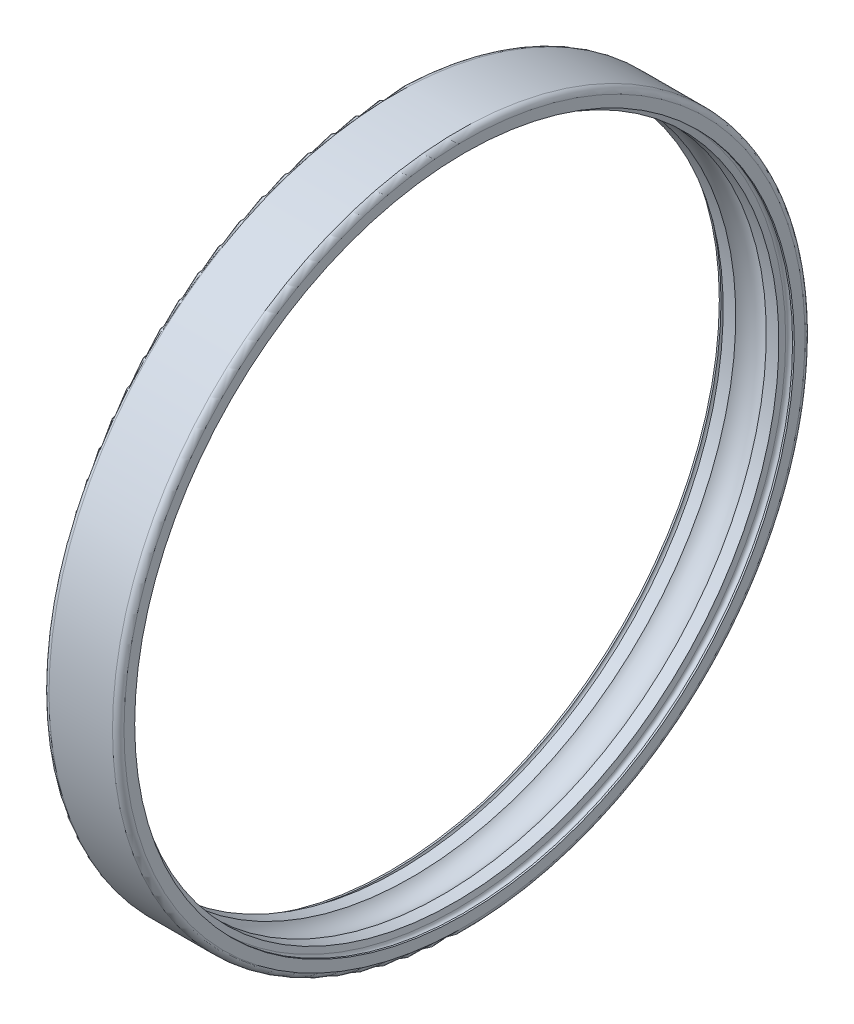
ISO-10303-21;
HEADER;
FILE_DESCRIPTION(('STEP AP214'),'2;1');
FILE_NAME('part.step','',(''),(''),'','','');
FILE_SCHEMA(('AUTOMOTIVE_DESIGN { 1 0 10303 214 1 1 1 1 }'));
ENDSEC;
DATA;
#1=APPLICATION_CONTEXT('core data for automotive mechanical design processes');
#2=APPLICATION_PROTOCOL_DEFINITION('international standard','automotive_design',2000,#1);
#3=PRODUCT_CONTEXT('',#1,'mechanical');
#4=PRODUCT('Part','Part','',(#3));
#5=PRODUCT_RELATED_PRODUCT_CATEGORY('part','',(#4));
#6=PRODUCT_DEFINITION_FORMATION('','',#4);
#7=PRODUCT_DEFINITION_CONTEXT('part definition',#1,'design');
#8=PRODUCT_DEFINITION('design','',#6,#7);
#9=PRODUCT_DEFINITION_SHAPE('','',#8);
#10=(LENGTH_UNIT() NAMED_UNIT(*) SI_UNIT(.MILLI.,.METRE.));
#11=(NAMED_UNIT(*) PLANE_ANGLE_UNIT() SI_UNIT($,.RADIAN.));
#12=(NAMED_UNIT(*) SI_UNIT($,.STERADIAN.) SOLID_ANGLE_UNIT());
#13=UNCERTAINTY_MEASURE_WITH_UNIT(LENGTH_MEASURE(1.E-05),#10,'distance_accuracy_value','');
#14=(GEOMETRIC_REPRESENTATION_CONTEXT(3) GLOBAL_UNCERTAINTY_ASSIGNED_CONTEXT((#13)) GLOBAL_UNIT_ASSIGNED_CONTEXT((#10,
#11,#12)) REPRESENTATION_CONTEXT('',''));
#15=CARTESIAN_POINT('',(0.,0.,0.));
#16=DIRECTION('',(0.,0.,1.));
#17=DIRECTION('',(1.,0.,0.));
#18=AXIS2_PLACEMENT_3D('',#15,#16,#17);
#19=CARTESIAN_POINT('',(0.,59.,0.));
#20=DIRECTION('',(1.,0.,0.));
#21=DIRECTION('',(0.,0.,-1.));
#22=AXIS2_PLACEMENT_3D('',#19,#20,#21);
#23=PLANE('',#22);
#24=CARTESIAN_POINT('',(0.,0.,0.));
#25=DIRECTION('',(-1.,0.,0.));
#26=DIRECTION('',(0.,0.,1.));
#27=AXIS2_PLACEMENT_3D('',#24,#25,#26);
#28=CIRCLE('',#27,57.15);
#29=CARTESIAN_POINT('',(0.,0.,57.15));
#30=VERTEX_POINT('',#29);
#31=EDGE_CURVE('E77',#30,#30,#28,.T.);
#32=ORIENTED_EDGE('',*,*,#31,.F.);
#33=EDGE_LOOP('',(#32));
#34=FACE_BOUND('',#33,.T.);
#35=CARTESIAN_POINT('',(0.,0.,0.));
#36=DIRECTION('',(-1.,0.,0.));
#37=DIRECTION('',(0.,0.,1.));
#38=AXIS2_PLACEMENT_3D('',#35,#36,#37);
#39=CIRCLE('',#38,59.);
#40=CARTESIAN_POINT('',(0.,0.,59.));
#41=VERTEX_POINT('',#40);
#42=EDGE_CURVE('E10',#41,#41,#39,.T.);
#43=ORIENTED_EDGE('',*,*,#42,.T.);
#44=EDGE_LOOP('',(#43));
#45=FACE_BOUND('',#44,.T.);
#46=ADVANCED_FACE('F31',(#34,#45),#23,.F.);
#47=CARTESIAN_POINT('',(0.99999999999922,0.,0.));
#48=DIRECTION('',(-1.,0.,0.));
#49=DIRECTION('',(0.,0.,1.));
#50=AXIS2_PLACEMENT_3D('',#47,#48,#49);
#51=TOROIDAL_SURFACE('',#50,59.0000000000008,0.999999999999222);
#52=ORIENTED_EDGE('',*,*,#42,.F.);
#53=EDGE_LOOP('',(#52));
#54=FACE_BOUND('',#53,.T.);
#55=CARTESIAN_POINT('',(1.,0.,0.));
#56=DIRECTION('',(-1.,0.,0.));
#57=DIRECTION('',(0.,0.,1.));
#58=AXIS2_PLACEMENT_3D('',#55,#56,#57);
#59=CIRCLE('',#58,60.);
#60=CARTESIAN_POINT('',(1.,0.,60.));
#61=VERTEX_POINT('',#60);
#62=EDGE_CURVE('E37',#61,#61,#59,.T.);
#63=ORIENTED_EDGE('',*,*,#62,.T.);
#64=EDGE_LOOP('',(#63));
#65=FACE_BOUND('',#64,.T.);
#66=ADVANCED_FACE('F84',(#54,#65),#51,.T.);
#67=CARTESIAN_POINT('',(50.,0.,0.));
#68=DIRECTION('',(-1.,0.,0.));
#69=DIRECTION('',(0.,0.,1.));
#70=AXIS2_PLACEMENT_3D('',#67,#68,#69);
#71=CYLINDRICAL_SURFACE('',#70,60.);
#72=ORIENTED_EDGE('',*,*,#62,.F.);
#73=EDGE_LOOP('',(#72));
#74=FACE_BOUND('',#73,.T.);
#75=CARTESIAN_POINT('',(12.,0.,0.));
#76=DIRECTION('',(-1.,0.,0.));
#77=DIRECTION('',(0.,0.,1.));
#78=AXIS2_PLACEMENT_3D('',#75,#76,#77);
#79=CIRCLE('',#78,60.);
#80=CARTESIAN_POINT('',(12.,0.,60.));
#81=VERTEX_POINT('',#80);
#82=EDGE_CURVE('E41',#81,#81,#79,.T.);
#83=ORIENTED_EDGE('',*,*,#82,.T.);
#84=EDGE_LOOP('',(#83));
#85=FACE_BOUND('',#84,.T.);
#86=ADVANCED_FACE('F88',(#74,#85),#71,.T.);
#87=CARTESIAN_POINT('',(12.0000000000015,0.,0.));
#88=DIRECTION('',(-1.,0.,0.));
#89=DIRECTION('',(0.,0.,1.));
#90=AXIS2_PLACEMENT_3D('',#87,#88,#89);
#91=TOROIDAL_SURFACE('',#90,59.0000000000015,0.999999999998453);
#92=ORIENTED_EDGE('',*,*,#82,.F.);
#93=EDGE_LOOP('',(#92));
#94=FACE_BOUND('',#93,.T.);
#95=CARTESIAN_POINT('',(13.,0.,0.));
#96=DIRECTION('',(-1.,0.,0.));
#97=DIRECTION('',(0.,0.,1.));
#98=AXIS2_PLACEMENT_3D('',#95,#96,#97);
#99=CIRCLE('',#98,59.);
#100=CARTESIAN_POINT('',(13.,0.,59.));
#101=VERTEX_POINT('',#100);
#102=EDGE_CURVE('E45',#101,#101,#99,.T.);
#103=ORIENTED_EDGE('',*,*,#102,.T.);
#104=EDGE_LOOP('',(#103));
#105=FACE_BOUND('',#104,.T.);
#106=ADVANCED_FACE('F93',(#94,#105),#91,.T.);
#107=CARTESIAN_POINT('',(13.,57.15,0.));
#108=DIRECTION('',(-1.,0.,0.));
#109=DIRECTION('',(0.,0.,1.));
#110=AXIS2_PLACEMENT_3D('',#107,#108,#109);
#111=PLANE('',#110);
#112=ORIENTED_EDGE('',*,*,#102,.F.);
#113=EDGE_LOOP('',(#112));
#114=FACE_BOUND('',#113,.T.);
#115=CARTESIAN_POINT('',(13.,0.,0.));
#116=DIRECTION('',(-1.,0.,0.));
#117=DIRECTION('',(0.,0.,1.));
#118=AXIS2_PLACEMENT_3D('',#115,#116,#117);
#119=CIRCLE('',#118,57.15);
#120=CARTESIAN_POINT('',(13.,0.,57.15));
#121=VERTEX_POINT('',#120);
#122=EDGE_CURVE('E50',#121,#121,#119,.T.);
#123=ORIENTED_EDGE('',*,*,#122,.T.);
#124=EDGE_LOOP('',(#123));
#125=FACE_BOUND('',#124,.T.);
#126=ADVANCED_FACE('F99',(#114,#125),#111,.F.);
#127=CARTESIAN_POINT('',(50.,0.,0.));
#128=DIRECTION('',(-1.,0.,0.));
#129=DIRECTION('',(0.,0.,1.));
#130=AXIS2_PLACEMENT_3D('',#127,#128,#129);
#131=CYLINDRICAL_SURFACE('',#130,57.15);
#132=ORIENTED_EDGE('',*,*,#122,.F.);
#133=EDGE_LOOP('',(#132));
#134=FACE_BOUND('',#133,.T.);
#135=CARTESIAN_POINT('',(12.7,0.,0.));
#136=DIRECTION('',(-1.,0.,0.));
#137=DIRECTION('',(0.,0.,1.));
#138=AXIS2_PLACEMENT_3D('',#135,#136,#137);
#139=CIRCLE('',#138,57.15);
#140=CARTESIAN_POINT('',(12.7,0.,57.15));
#141=VERTEX_POINT('',#140);
#142=EDGE_CURVE('E53',#141,#141,#139,.T.);
#143=ORIENTED_EDGE('',*,*,#142,.T.);
#144=EDGE_LOOP('',(#143));
#145=FACE_BOUND('',#144,.T.);
#146=ADVANCED_FACE('F103',(#134,#145),#131,.F.);
#147=CARTESIAN_POINT('',(12.1,0.,0.));
#148=DIRECTION('',(-1.,0.,0.));
#149=DIRECTION('',(0.,0.,1.));
#150=AXIS2_PLACEMENT_3D('',#147,#148,#149);
#151=TOROIDAL_SURFACE('',#150,57.15,0.6);
#152=ORIENTED_EDGE('',*,*,#142,.F.);
#153=EDGE_LOOP('',(#152));
#154=FACE_BOUND('',#153,.T.);
#155=CARTESIAN_POINT('',(11.5,0.,0.));
#156=DIRECTION('',(-1.,0.,0.));
#157=DIRECTION('',(0.,0.,1.));
#158=AXIS2_PLACEMENT_3D('',#155,#156,#157);
#159=CIRCLE('',#158,57.15);
#160=CARTESIAN_POINT('',(11.5,0.,57.15));
#161=VERTEX_POINT('',#160);
#162=EDGE_CURVE('E56',#161,#161,#159,.T.);
#163=ORIENTED_EDGE('',*,*,#162,.T.);
#164=EDGE_LOOP('',(#163));
#165=FACE_BOUND('',#164,.T.);
#166=ADVANCED_FACE('F107',(#154,#165),#151,.F.);
#167=CARTESIAN_POINT('',(11.323673019292,0.,0.));
#168=DIRECTION('',(1.,0.,0.));
#169=DIRECTION('',(0.,0.,-1.));
#170=AXIS2_PLACEMENT_3D('',#167,#168,#169);
#171=CONICAL_SURFACE('',#170,56.15,1.39626340159592);
#172=ORIENTED_EDGE('',*,*,#162,.F.);
#173=EDGE_LOOP('',(#172));
#174=FACE_BOUND('',#173,.T.);
#175=CARTESIAN_POINT('',(11.323673019292,0.,0.));
#176=DIRECTION('',(-1.,0.,0.));
#177=DIRECTION('',(0.,0.,1.));
#178=AXIS2_PLACEMENT_3D('',#175,#176,#177);
#179=CIRCLE('',#178,56.15);
#180=CARTESIAN_POINT('',(11.323673019292,0.,56.15));
#181=VERTEX_POINT('',#180);
#182=EDGE_CURVE('E59',#181,#181,#179,.T.);
#183=ORIENTED_EDGE('',*,*,#182,.T.);
#184=EDGE_LOOP('',(#183));
#185=FACE_BOUND('',#184,.T.);
#186=ADVANCED_FACE('F111',(#174,#185),#171,.F.);
#187=CARTESIAN_POINT('',(50.,0.,0.));
#188=DIRECTION('',(-1.,0.,0.));
#189=DIRECTION('',(0.,0.,1.));
#190=AXIS2_PLACEMENT_3D('',#187,#188,#189);
#191=CYLINDRICAL_SURFACE('',#190,56.15);
#192=ORIENTED_EDGE('',*,*,#182,.F.);
#193=EDGE_LOOP('',(#192));
#194=FACE_BOUND('',#193,.T.);
#195=CARTESIAN_POINT('',(9.1455970970652,0.,0.));
#196=DIRECTION('',(-1.,0.,0.));
#197=DIRECTION('',(0.,0.,1.));
#198=AXIS2_PLACEMENT_3D('',#195,#196,#197);
#199=CIRCLE('',#198,56.15);
#200=CARTESIAN_POINT('',(9.1455970970652,0.,56.15));
#201=VERTEX_POINT('',#200);
#202=EDGE_CURVE('E62',#201,#201,#199,.T.);
#203=ORIENTED_EDGE('',*,*,#202,.T.);
#204=EDGE_LOOP('',(#203));
#205=FACE_BOUND('',#204,.T.);
#206=ADVANCED_FACE('F115',(#194,#205),#191,.F.);
#207=CARTESIAN_POINT('',(6.5,0.,0.));
#208=DIRECTION('',(-1.,0.,0.));
#209=DIRECTION('',(0.,0.,1.));
#210=AXIS2_PLACEMENT_3D('',#207,#208,#209);
#211=TOROIDAL_SURFACE('',#210,53.7500000000001,3.57199999999993);
#212=ORIENTED_EDGE('',*,*,#202,.F.);
#213=EDGE_LOOP('',(#212));
#214=FACE_BOUND('',#213,.T.);
#215=CARTESIAN_POINT('',(3.8544029029348,0.,0.));
#216=DIRECTION('',(-1.,0.,0.));
#217=DIRECTION('',(0.,0.,1.));
#218=AXIS2_PLACEMENT_3D('',#215,#216,#217);
#219=CIRCLE('',#218,56.15);
#220=CARTESIAN_POINT('',(3.8544029029348,0.,56.15));
#221=VERTEX_POINT('',#220);
#222=EDGE_CURVE('E65',#221,#221,#219,.T.);
#223=ORIENTED_EDGE('',*,*,#222,.T.);
#224=EDGE_LOOP('',(#223));
#225=FACE_BOUND('',#224,.T.);
#226=ADVANCED_FACE('F119',(#214,#225),#211,.F.);
#227=CARTESIAN_POINT('',(50.,0.,0.));
#228=DIRECTION('',(-1.,0.,0.));
#229=DIRECTION('',(0.,0.,1.));
#230=AXIS2_PLACEMENT_3D('',#227,#228,#229);
#231=CYLINDRICAL_SURFACE('',#230,56.15);
#232=ORIENTED_EDGE('',*,*,#222,.F.);
#233=EDGE_LOOP('',(#232));
#234=FACE_BOUND('',#233,.T.);
#235=CARTESIAN_POINT('',(1.6763269807085,0.,0.));
#236=DIRECTION('',(-1.,0.,0.));
#237=DIRECTION('',(0.,0.,1.));
#238=AXIS2_PLACEMENT_3D('',#235,#236,#237);
#239=CIRCLE('',#238,56.15);
#240=CARTESIAN_POINT('',(1.6763269807085,0.,56.15));
#241=VERTEX_POINT('',#240);
#242=EDGE_CURVE('E68',#241,#241,#239,.T.);
#243=ORIENTED_EDGE('',*,*,#242,.T.);
#244=EDGE_LOOP('',(#243));
#245=FACE_BOUND('',#244,.T.);
#246=ADVANCED_FACE('F123',(#234,#245),#231,.F.);
#247=CARTESIAN_POINT('',(1.5,0.,0.));
#248=DIRECTION('',(-1.,0.,0.));
#249=DIRECTION('',(0.,0.,1.));
#250=AXIS2_PLACEMENT_3D('',#247,#248,#249);
#251=CONICAL_SURFACE('',#250,57.15,1.39626340159543);
#252=ORIENTED_EDGE('',*,*,#242,.F.);
#253=EDGE_LOOP('',(#252));
#254=FACE_BOUND('',#253,.T.);
#255=CARTESIAN_POINT('',(1.5,0.,0.));
#256=DIRECTION('',(-1.,0.,0.));
#257=DIRECTION('',(0.,0.,1.));
#258=AXIS2_PLACEMENT_3D('',#255,#256,#257);
#259=CIRCLE('',#258,57.15);
#260=CARTESIAN_POINT('',(1.5,0.,57.15));
#261=VERTEX_POINT('',#260);
#262=EDGE_CURVE('E71',#261,#261,#259,.T.);
#263=ORIENTED_EDGE('',*,*,#262,.T.);
#264=EDGE_LOOP('',(#263));
#265=FACE_BOUND('',#264,.T.);
#266=ADVANCED_FACE('F127',(#254,#265),#251,.F.);
#267=CARTESIAN_POINT('',(0.9,0.,0.));
#268=DIRECTION('',(-1.,0.,0.));
#269=DIRECTION('',(0.,0.,1.));
#270=AXIS2_PLACEMENT_3D('',#267,#268,#269);
#271=TOROIDAL_SURFACE('',#270,57.15,0.6);
#272=ORIENTED_EDGE('',*,*,#262,.F.);
#273=EDGE_LOOP('',(#272));
#274=FACE_BOUND('',#273,.T.);
#275=CARTESIAN_POINT('',(0.300000000000002,0.,0.));
#276=DIRECTION('',(-1.,0.,0.));
#277=DIRECTION('',(0.,0.,1.));
#278=AXIS2_PLACEMENT_3D('',#275,#276,#277);
#279=CIRCLE('',#278,57.15);
#280=CARTESIAN_POINT('',(0.300000000000002,0.,57.15));
#281=VERTEX_POINT('',#280);
#282=EDGE_CURVE('E74',#281,#281,#279,.T.);
#283=ORIENTED_EDGE('',*,*,#282,.T.);
#284=EDGE_LOOP('',(#283));
#285=FACE_BOUND('',#284,.T.);
#286=ADVANCED_FACE('F131',(#274,#285),#271,.F.);
#287=CARTESIAN_POINT('',(50.,0.,0.));
#288=DIRECTION('',(-1.,0.,0.));
#289=DIRECTION('',(0.,0.,1.));
#290=AXIS2_PLACEMENT_3D('',#287,#288,#289);
#291=CYLINDRICAL_SURFACE('',#290,57.15);
#292=ORIENTED_EDGE('',*,*,#282,.F.);
#293=EDGE_LOOP('',(#292));
#294=FACE_BOUND('',#293,.T.);
#295=ORIENTED_EDGE('',*,*,#31,.T.);
#296=EDGE_LOOP('',(#295));
#297=FACE_BOUND('',#296,.T.);
#298=ADVANCED_FACE('F81',(#294,#297),#291,.F.);
#299=CLOSED_SHELL('',(#46,#66,#86,#106,#126,#146,#166,#186,#206,#226,#246,#266,#286,#298));
#300=MANIFOLD_SOLID_BREP('B2',#299);
#301=ADVANCED_BREP_SHAPE_REPRESENTATION('',(#18,#300),#14);
#302=SHAPE_DEFINITION_REPRESENTATION(#9,#301);
ENDSEC;
END-ISO-10303-21;
